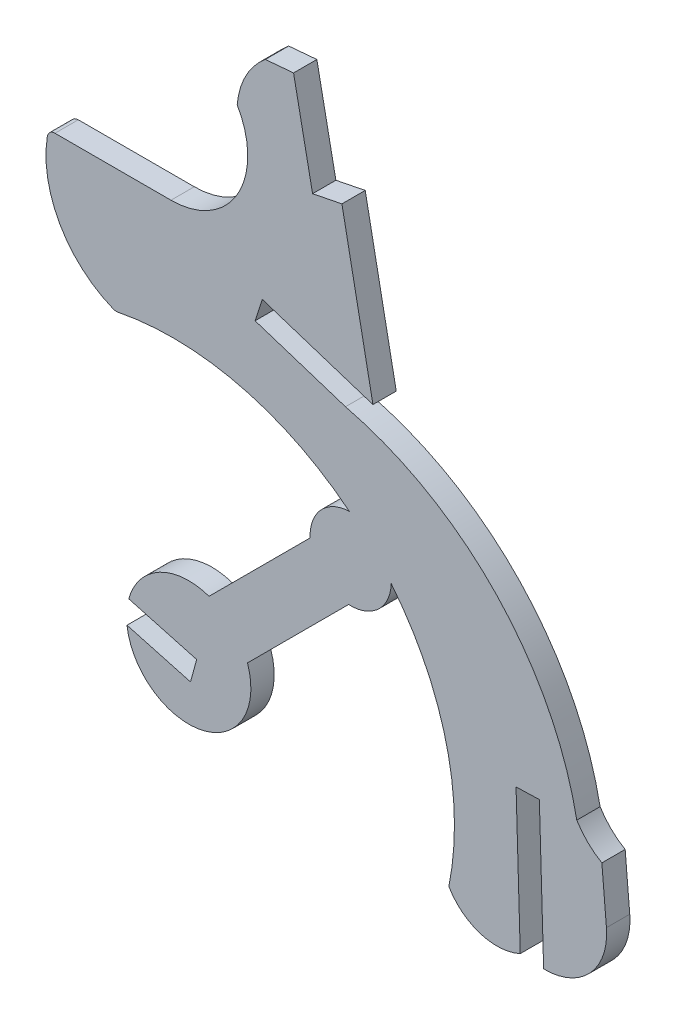
ISO-10303-21;
HEADER;
FILE_DESCRIPTION(('STEP AP214'),'2;1');
FILE_NAME('part.step','',(''),(''),'','','');
FILE_SCHEMA(('AUTOMOTIVE_DESIGN { 1 0 10303 214 1 1 1 1 }'));
ENDSEC;
DATA;
#1=APPLICATION_CONTEXT('core data for automotive mechanical design processes');
#2=APPLICATION_PROTOCOL_DEFINITION('international standard','automotive_design',2000,#1);
#3=PRODUCT_CONTEXT('',#1,'mechanical');
#4=PRODUCT('Part','Part','',(#3));
#5=PRODUCT_RELATED_PRODUCT_CATEGORY('part','',(#4));
#6=PRODUCT_DEFINITION_FORMATION('','',#4);
#7=PRODUCT_DEFINITION_CONTEXT('part definition',#1,'design');
#8=PRODUCT_DEFINITION('design','',#6,#7);
#9=PRODUCT_DEFINITION_SHAPE('','',#8);
#10=(LENGTH_UNIT() NAMED_UNIT(*) SI_UNIT(.MILLI.,.METRE.));
#11=(NAMED_UNIT(*) PLANE_ANGLE_UNIT() SI_UNIT($,.RADIAN.));
#12=(NAMED_UNIT(*) SI_UNIT($,.STERADIAN.) SOLID_ANGLE_UNIT());
#13=UNCERTAINTY_MEASURE_WITH_UNIT(LENGTH_MEASURE(1.E-05),#10,'distance_accuracy_value','');
#14=(GEOMETRIC_REPRESENTATION_CONTEXT(3) GLOBAL_UNCERTAINTY_ASSIGNED_CONTEXT((#13)) GLOBAL_UNIT_ASSIGNED_CONTEXT((#10,
#11,#12)) REPRESENTATION_CONTEXT('',''));
#15=CARTESIAN_POINT('',(0.,0.,0.));
#16=DIRECTION('',(0.,0.,1.));
#17=DIRECTION('',(1.,0.,0.));
#18=AXIS2_PLACEMENT_3D('',#15,#16,#17);
#19=CARTESIAN_POINT('',(293.065685578084,731.343473214868,3.));
#20=DIRECTION('',(-0.951371586233603,0.308045621470843,0.));
#21=DIRECTION('',(-0.308045621470843,-0.951371586233603,0.));
#22=AXIS2_PLACEMENT_3D('',#19,#20,#21);
#23=PLANE('',#22);
#24=DIRECTION('',(0.308045621470843,0.951371586233603,0.));
#25=VECTOR('',#24,1.);
#26=CARTESIAN_POINT('',(293.065685578084,731.343473214868,0.));
#27=LINE('',#26,#25);
#28=CARTESIAN_POINT('',(293.065685578084,731.343473214868,0.));
#29=VERTEX_POINT('',#28);
#30=CARTESIAN_POINT('',(293.989820861759,734.197583091601,0.));
#31=VERTEX_POINT('',#30);
#32=EDGE_CURVE('E274',#29,#31,#27,.T.);
#33=ORIENTED_EDGE('',*,*,#32,.T.);
#34=DIRECTION('',(0.,0.,-1.));
#35=VECTOR('',#34,1.);
#36=CARTESIAN_POINT('',(293.989820861759,734.197583091601,3.));
#37=LINE('',#36,#35);
#38=CARTESIAN_POINT('',(293.989820861759,734.197583091601,3.));
#39=VERTEX_POINT('',#38);
#40=EDGE_CURVE('E11',#39,#31,#37,.T.);
#41=ORIENTED_EDGE('',*,*,#40,.F.);
#42=DIRECTION('',(0.308045621470843,0.951371586233603,0.));
#43=VECTOR('',#42,1.);
#44=CARTESIAN_POINT('',(293.065685578084,731.343473214868,3.));
#45=LINE('',#44,#43);
#46=CARTESIAN_POINT('',(293.065685578084,731.343473214868,3.));
#47=VERTEX_POINT('',#46);
#48=EDGE_CURVE('E336',#47,#39,#45,.T.);
#49=ORIENTED_EDGE('',*,*,#48,.F.);
#50=DIRECTION('',(0.,0.,-1.));
#51=VECTOR('',#50,1.);
#52=CARTESIAN_POINT('',(293.065685578084,731.343473214868,3.));
#53=LINE('',#52,#51);
#54=EDGE_CURVE('E270',#47,#29,#53,.T.);
#55=ORIENTED_EDGE('',*,*,#54,.T.);
#56=EDGE_LOOP('',(#33,#41,#49,#55));
#57=FACE_BOUND('',#56,.T.);
#58=ADVANCED_FACE('F34',(#57),#23,.F.);
#59=CARTESIAN_POINT('',(293.989820861759,734.197583091601,3.));
#60=DIRECTION('',(0.308045621470846,0.951371586233602,0.));
#61=DIRECTION('',(-0.951371586233602,0.308045621470846,0.));
#62=AXIS2_PLACEMENT_3D('',#59,#60,#61);
#63=PLANE('',#62);
#64=DIRECTION('',(0.951371586233602,-0.308045621470846,0.));
#65=VECTOR('',#64,1.);
#66=CARTESIAN_POINT('',(293.989820861759,734.197583091601,0.));
#67=LINE('',#66,#65);
#68=CARTESIAN_POINT('',(308.230093843599,729.586709901693,0.));
#69=VERTEX_POINT('',#68);
#70=EDGE_CURVE('E277',#31,#69,#67,.T.);
#71=ORIENTED_EDGE('',*,*,#70,.T.);
#72=DIRECTION('',(0.,0.,-1.));
#73=VECTOR('',#72,1.);
#74=CARTESIAN_POINT('',(308.230093843599,729.586709901693,3.));
#75=LINE('',#74,#73);
#76=CARTESIAN_POINT('',(308.230093843599,729.586709901693,3.));
#77=VERTEX_POINT('',#76);
#78=EDGE_CURVE('E42',#77,#69,#75,.T.);
#79=ORIENTED_EDGE('',*,*,#78,.F.);
#80=DIRECTION('',(0.951371586233602,-0.308045621470846,0.));
#81=VECTOR('',#80,1.);
#82=CARTESIAN_POINT('',(293.989820861759,734.197583091601,3.));
#83=LINE('',#82,#81);
#84=EDGE_CURVE('E165',#39,#77,#83,.T.);
#85=ORIENTED_EDGE('',*,*,#84,.F.);
#86=ORIENTED_EDGE('',*,*,#40,.T.);
#87=EDGE_LOOP('',(#71,#79,#85,#86));
#88=FACE_BOUND('',#87,.T.);
#89=ADVANCED_FACE('F514',(#88),#63,.F.);
#90=CARTESIAN_POINT('',(304.237578803965,749.960041405794,3.));
#91=DIRECTION('',(-0.981334260891435,-0.192309823983752,0.));
#92=DIRECTION('',(0.192309823983752,-0.981334260891435,0.));
#93=AXIS2_PLACEMENT_3D('',#90,#91,#92);
#94=PLANE('',#93);
#95=DIRECTION('',(-0.192309823983752,0.981334260891435,0.));
#96=VECTOR('',#95,1.);
#97=CARTESIAN_POINT('',(304.237578803965,749.960041405794,0.));
#98=LINE('',#97,#96);
#99=CARTESIAN_POINT('',(304.237578803965,749.960041405794,0.));
#100=VERTEX_POINT('',#99);
#101=EDGE_CURVE('E279',#69,#100,#98,.T.);
#102=ORIENTED_EDGE('',*,*,#101,.T.);
#103=DIRECTION('',(0.,0.,-1.));
#104=VECTOR('',#103,1.);
#105=CARTESIAN_POINT('',(304.237578803965,749.960041405794,3.));
#106=LINE('',#105,#104);
#107=CARTESIAN_POINT('',(304.237578803965,749.960041405794,3.));
#108=VERTEX_POINT('',#107);
#109=EDGE_CURVE('E415',#108,#100,#106,.T.);
#110=ORIENTED_EDGE('',*,*,#109,.F.);
#111=DIRECTION('',(-0.192309823983752,0.981334260891435,0.));
#112=VECTOR('',#111,1.);
#113=CARTESIAN_POINT('',(304.237578803965,749.960041405794,3.));
#114=LINE('',#113,#112);
#115=EDGE_CURVE('E423',#77,#108,#114,.T.);
#116=ORIENTED_EDGE('',*,*,#115,.F.);
#117=ORIENTED_EDGE('',*,*,#78,.T.);
#118=EDGE_LOOP('',(#102,#110,#116,#117));
#119=FACE_BOUND('',#118,.T.);
#120=ADVANCED_FACE('F421',(#119),#94,.F.);
#121=CARTESIAN_POINT('',(304.237578803965,749.960041405794,3.));
#122=DIRECTION('',(0.196059702771073,-0.980591960475568,0.));
#123=DIRECTION('',(0.980591960475568,0.196059702771073,0.));
#124=AXIS2_PLACEMENT_3D('',#121,#122,#123);
#125=PLANE('',#124);
#126=DIRECTION('',(-0.980591960475568,-0.196059702771073,0.));
#127=VECTOR('',#126,1.);
#128=CARTESIAN_POINT('',(304.237578803965,749.960041405794,0.));
#129=LINE('',#128,#127);
#130=CARTESIAN_POINT('',(300.461876989639,749.205127022129,0.));
#131=VERTEX_POINT('',#130);
#132=EDGE_CURVE('E281',#100,#131,#129,.T.);
#133=ORIENTED_EDGE('',*,*,#132,.T.);
#134=DIRECTION('',(0.,0.,-1.));
#135=VECTOR('',#134,1.);
#136=CARTESIAN_POINT('',(300.461876989639,749.205127022129,3.));
#137=LINE('',#136,#135);
#138=CARTESIAN_POINT('',(300.461876989639,749.205127022129,3.));
#139=VERTEX_POINT('',#138);
#140=EDGE_CURVE('E412',#139,#131,#137,.T.);
#141=ORIENTED_EDGE('',*,*,#140,.F.);
#142=DIRECTION('',(-0.980591960475568,-0.196059702771073,0.));
#143=VECTOR('',#142,1.);
#144=CARTESIAN_POINT('',(304.237578803965,749.960041405794,3.));
#145=LINE('',#144,#143);
#146=EDGE_CURVE('E441',#108,#139,#145,.T.);
#147=ORIENTED_EDGE('',*,*,#146,.F.);
#148=ORIENTED_EDGE('',*,*,#109,.T.);
#149=EDGE_LOOP('',(#133,#141,#147,#148));
#150=FACE_BOUND('',#149,.T.);
#151=ADVANCED_FACE('F432',(#150),#125,.F.);
#152=CARTESIAN_POINT('',(300.461876989639,749.205127022129,3.));
#153=DIRECTION('',(-0.98059196047557,-0.196059702771065,0.));
#154=DIRECTION('',(0.196059702771066,-0.98059196047557,0.));
#155=AXIS2_PLACEMENT_3D('',#152,#153,#154);
#156=PLANE('',#155);
#157=DIRECTION('',(-0.196059702771066,0.98059196047557,0.));
#158=VECTOR('',#157,1.);
#159=CARTESIAN_POINT('',(300.461876989639,749.205127022129,0.));
#160=LINE('',#159,#158);
#161=CARTESIAN_POINT('',(298.014696402682,761.444692702814,0.));
#162=VERTEX_POINT('',#161);
#163=EDGE_CURVE('E283',#131,#162,#160,.T.);
#164=ORIENTED_EDGE('',*,*,#163,.T.);
#165=DIRECTION('',(0.,0.,-1.));
#166=VECTOR('',#165,1.);
#167=CARTESIAN_POINT('',(298.014696402682,761.444692702814,3.));
#168=LINE('',#167,#166);
#169=CARTESIAN_POINT('',(298.014696402682,761.444692702814,3.));
#170=VERTEX_POINT('',#169);
#171=EDGE_CURVE('E409',#170,#162,#168,.T.);
#172=ORIENTED_EDGE('',*,*,#171,.F.);
#173=DIRECTION('',(-0.196059702771066,0.98059196047557,0.));
#174=VECTOR('',#173,1.);
#175=CARTESIAN_POINT('',(300.461876989639,749.205127022129,3.));
#176=LINE('',#175,#174);
#177=EDGE_CURVE('E438',#139,#170,#176,.T.);
#178=ORIENTED_EDGE('',*,*,#177,.F.);
#179=ORIENTED_EDGE('',*,*,#140,.T.);
#180=EDGE_LOOP('',(#164,#172,#178,#179));
#181=FACE_BOUND('',#180,.T.);
#182=ADVANCED_FACE('F436',(#181),#156,.F.);
#183=CARTESIAN_POINT('',(298.014696402682,761.444692702814,3.));
#184=DIRECTION('',(0.0872020705690087,-0.996190643847089,0.));
#185=DIRECTION('',(0.996190643847089,0.0872020705690087,0.));
#186=AXIS2_PLACEMENT_3D('',#183,#184,#185);
#187=PLANE('',#186);
#188=DIRECTION('',(-0.996190643847089,-0.0872020705690087,0.));
#189=VECTOR('',#188,1.);
#190=CARTESIAN_POINT('',(298.014696402682,761.444692702814,0.));
#191=LINE('',#190,#189);
#192=CARTESIAN_POINT('',(294.380010044937,761.126528525885,0.));
#193=VERTEX_POINT('',#192);
#194=EDGE_CURVE('E285',#162,#193,#191,.T.);
#195=ORIENTED_EDGE('',*,*,#194,.T.);
#196=DIRECTION('',(0.,0.,-1.));
#197=VECTOR('',#196,1.);
#198=CARTESIAN_POINT('',(294.380010044937,761.126528525885,3.));
#199=LINE('',#198,#197);
#200=CARTESIAN_POINT('',(294.380010044937,761.126528525885,3.));
#201=VERTEX_POINT('',#200);
#202=EDGE_CURVE('E406',#201,#193,#199,.T.);
#203=ORIENTED_EDGE('',*,*,#202,.F.);
#204=DIRECTION('',(-0.996190643847089,-0.0872020705690087,0.));
#205=VECTOR('',#204,1.);
#206=CARTESIAN_POINT('',(298.014696402682,761.444692702814,3.));
#207=LINE('',#206,#205);
#208=EDGE_CURVE('E440',#170,#201,#207,.T.);
#209=ORIENTED_EDGE('',*,*,#208,.F.);
#210=ORIENTED_EDGE('',*,*,#171,.T.);
#211=EDGE_LOOP('',(#195,#203,#209,#210));
#212=FACE_BOUND('',#211,.T.);
#213=ADVANCED_FACE('F527',(#212),#187,.F.);
#214=CARTESIAN_POINT('',(300.689284113547,753.41474699255,3.));
#215=DIRECTION('',(0.,0.,-1.));
#216=DIRECTION('',(-1.,0.,0.));
#217=AXIS2_PLACEMENT_3D('',#214,#215,#216);
#218=CYLINDRICAL_SURFACE('',#217,9.96386038093235);
#219=CARTESIAN_POINT('',(300.689284113547,753.41474699255,0.));
#220=DIRECTION('',(0.,0.,1.));
#221=DIRECTION('',(1.,0.,0.));
#222=AXIS2_PLACEMENT_3D('',#219,#220,#221);
#223=CIRCLE('',#222,9.96386038093235);
#224=CARTESIAN_POINT('',(290.760865869976,754.254404584339,0.));
#225=VERTEX_POINT('',#224);
#226=EDGE_CURVE('E287',#193,#225,#223,.T.);
#227=ORIENTED_EDGE('',*,*,#226,.T.);
#228=DIRECTION('',(0.,0.,-1.));
#229=VECTOR('',#228,1.);
#230=CARTESIAN_POINT('',(290.760865869976,754.254404584339,3.));
#231=LINE('',#230,#229);
#232=CARTESIAN_POINT('',(290.760865869976,754.254404584339,3.));
#233=VERTEX_POINT('',#232);
#234=EDGE_CURVE('E403',#233,#225,#231,.T.);
#235=ORIENTED_EDGE('',*,*,#234,.F.);
#236=CARTESIAN_POINT('',(300.689284113547,753.41474699255,3.));
#237=DIRECTION('',(0.,0.,1.));
#238=DIRECTION('',(1.,0.,0.));
#239=AXIS2_PLACEMENT_3D('',#236,#237,#238);
#240=CIRCLE('',#239,9.96386038093235);
#241=EDGE_CURVE('E443',#201,#233,#240,.T.);
#242=ORIENTED_EDGE('',*,*,#241,.F.);
#243=ORIENTED_EDGE('',*,*,#202,.T.);
#244=EDGE_LOOP('',(#227,#235,#242,#243));
#245=FACE_BOUND('',#244,.T.);
#246=ADVANCED_FACE('F530',(#245),#218,.T.);
#247=CARTESIAN_POINT('',(282.238682163029,749.250936619308,3.));
#248=DIRECTION('',(0.,0.,-1.));
#249=DIRECTION('',(-1.,0.,0.));
#250=AXIS2_PLACEMENT_3D('',#247,#248,#249);
#251=CYLINDRICAL_SURFACE('',#250,9.88242413641695);
#252=CARTESIAN_POINT('',(282.238682163029,749.250936619308,0.));
#253=DIRECTION('',(0.,0.,-1.));
#254=DIRECTION('',(1.,0.,0.));
#255=AXIS2_PLACEMENT_3D('',#252,#253,#254);
#256=CIRCLE('',#255,9.88242413641695);
#257=CARTESIAN_POINT('',(282.238682163029,739.368512482891,0.));
#258=VERTEX_POINT('',#257);
#259=EDGE_CURVE('E289',#225,#258,#256,.T.);
#260=ORIENTED_EDGE('',*,*,#259,.T.);
#261=DIRECTION('',(0.,0.,-1.));
#262=VECTOR('',#261,1.);
#263=CARTESIAN_POINT('',(282.238682163029,739.368512482891,3.));
#264=LINE('',#263,#262);
#265=CARTESIAN_POINT('',(282.238682163029,739.368512482891,3.));
#266=VERTEX_POINT('',#265);
#267=EDGE_CURVE('E400',#266,#258,#264,.T.);
#268=ORIENTED_EDGE('',*,*,#267,.F.);
#269=CARTESIAN_POINT('',(282.238682163029,749.250936619308,3.));
#270=DIRECTION('',(0.,0.,-1.));
#271=DIRECTION('',(1.,0.,0.));
#272=AXIS2_PLACEMENT_3D('',#269,#270,#271);
#273=CIRCLE('',#272,9.88242413641695);
#274=EDGE_CURVE('E449',#233,#266,#273,.T.);
#275=ORIENTED_EDGE('',*,*,#274,.F.);
#276=ORIENTED_EDGE('',*,*,#234,.T.);
#277=EDGE_LOOP('',(#260,#268,#275,#276));
#278=FACE_BOUND('',#277,.T.);
#279=ADVANCED_FACE('F534',(#278),#251,.F.);
#280=CARTESIAN_POINT('',(282.238682163029,739.368512482891,3.));
#281=DIRECTION('',(0.,-1.,0.));
#282=DIRECTION('',(1.,0.,0.));
#283=AXIS2_PLACEMENT_3D('',#280,#281,#282);
#284=PLANE('',#283);
#285=DIRECTION('',(-1.,0.,0.));
#286=VECTOR('',#285,1.);
#287=CARTESIAN_POINT('',(282.238682163029,739.368512482891,0.));
#288=LINE('',#287,#286);
#289=CARTESIAN_POINT('',(267.309755895386,739.368512482891,0.));
#290=VERTEX_POINT('',#289);
#291=EDGE_CURVE('E291',#258,#290,#288,.T.);
#292=ORIENTED_EDGE('',*,*,#291,.T.);
#293=DIRECTION('',(0.,0.,-1.));
#294=VECTOR('',#293,1.);
#295=CARTESIAN_POINT('',(267.309755895386,739.368512482891,3.));
#296=LINE('',#295,#294);
#297=CARTESIAN_POINT('',(267.309755895386,739.368512482891,3.));
#298=VERTEX_POINT('',#297);
#299=EDGE_CURVE('E397',#298,#290,#296,.T.);
#300=ORIENTED_EDGE('',*,*,#299,.F.);
#301=DIRECTION('',(-1.,0.,0.));
#302=VECTOR('',#301,1.);
#303=CARTESIAN_POINT('',(282.238682163029,739.368512482891,3.));
#304=LINE('',#303,#302);
#305=EDGE_CURVE('E451',#266,#298,#304,.T.);
#306=ORIENTED_EDGE('',*,*,#305,.F.);
#307=ORIENTED_EDGE('',*,*,#267,.T.);
#308=EDGE_LOOP('',(#292,#300,#306,#307));
#309=FACE_BOUND('',#308,.T.);
#310=ADVANCED_FACE('F538',(#309),#284,.F.);
#311=CARTESIAN_POINT('',(267.309755895386,738.368512482891,3.));
#312=DIRECTION('',(0.,0.,-1.));
#313=DIRECTION('',(-1.,0.,0.));
#314=AXIS2_PLACEMENT_3D('',#311,#312,#313);
#315=CYLINDRICAL_SURFACE('',#314,1.);
#316=CARTESIAN_POINT('',(267.309755895386,738.368512482891,0.));
#317=DIRECTION('',(0.,0.,1.));
#318=DIRECTION('',(-1.,0.,0.));
#319=AXIS2_PLACEMENT_3D('',#316,#317,#318);
#320=CIRCLE('',#319,1.);
#321=CARTESIAN_POINT('',(266.322292677375,738.52636175617,0.));
#322=VERTEX_POINT('',#321);
#323=EDGE_CURVE('E293',#290,#322,#320,.T.);
#324=ORIENTED_EDGE('',*,*,#323,.T.);
#325=DIRECTION('',(0.,0.,-1.));
#326=VECTOR('',#325,1.);
#327=CARTESIAN_POINT('',(266.322292677375,738.52636175617,3.));
#328=LINE('',#327,#326);
#329=CARTESIAN_POINT('',(266.322292677375,738.52636175617,3.));
#330=VERTEX_POINT('',#329);
#331=EDGE_CURVE('E394',#330,#322,#328,.T.);
#332=ORIENTED_EDGE('',*,*,#331,.F.);
#333=CARTESIAN_POINT('',(267.309755895386,738.368512482891,3.));
#334=DIRECTION('',(0.,0.,1.));
#335=DIRECTION('',(-1.,0.,0.));
#336=AXIS2_PLACEMENT_3D('',#333,#334,#335);
#337=CIRCLE('',#336,1.);
#338=EDGE_CURVE('E453',#298,#330,#337,.T.);
#339=ORIENTED_EDGE('',*,*,#338,.F.);
#340=ORIENTED_EDGE('',*,*,#299,.T.);
#341=EDGE_LOOP('',(#324,#332,#339,#340));
#342=FACE_BOUND('',#341,.T.);
#343=ADVANCED_FACE('F542',(#342),#315,.T.);
#344=CARTESIAN_POINT('',(279.958666677143,736.34654210642,3.));
#345=DIRECTION('',(0.,0.,-1.));
#346=DIRECTION('',(-1.,0.,0.));
#347=AXIS2_PLACEMENT_3D('',#344,#345,#346);
#348=CYLINDRICAL_SURFACE('',#347,13.8095006994094);
#349=CARTESIAN_POINT('',(279.958666677143,736.34654210642,0.));
#350=DIRECTION('',(0.,0.,1.));
#351=DIRECTION('',(1.,0.,0.));
#352=AXIS2_PLACEMENT_3D('',#349,#350,#351);
#353=CIRCLE('',#352,13.8095006994094);
#354=CARTESIAN_POINT('',(274.828113717112,723.525476008341,0.));
#355=VERTEX_POINT('',#354);
#356=EDGE_CURVE('E295',#322,#355,#353,.T.);
#357=ORIENTED_EDGE('',*,*,#356,.T.);
#358=DIRECTION('',(0.,0.,-1.));
#359=VECTOR('',#358,1.);
#360=CARTESIAN_POINT('',(274.828113717112,723.525476008341,3.));
#361=LINE('',#360,#359);
#362=CARTESIAN_POINT('',(274.828113717112,723.525476008341,3.));
#363=VERTEX_POINT('',#362);
#364=EDGE_CURVE('E391',#363,#355,#361,.T.);
#365=ORIENTED_EDGE('',*,*,#364,.F.);
#366=CARTESIAN_POINT('',(279.958666677143,736.34654210642,3.));
#367=DIRECTION('',(0.,0.,1.));
#368=DIRECTION('',(1.,0.,0.));
#369=AXIS2_PLACEMENT_3D('',#366,#367,#368);
#370=CIRCLE('',#369,13.8095006994094);
#371=EDGE_CURVE('E455',#330,#363,#370,.T.);
#372=ORIENTED_EDGE('',*,*,#371,.F.);
#373=ORIENTED_EDGE('',*,*,#331,.T.);
#374=EDGE_LOOP('',(#357,#365,#372,#373));
#375=FACE_BOUND('',#374,.T.);
#376=ADVANCED_FACE('F546',(#375),#348,.T.);
#377=CARTESIAN_POINT('',(275.199637139407,724.453899589842,3.));
#378=DIRECTION('',(0.,0.,-1.));
#379=DIRECTION('',(-1.,0.,0.));
#380=AXIS2_PLACEMENT_3D('',#377,#378,#379);
#381=CYLINDRICAL_SURFACE('',#380,0.999999999999984);
#382=CARTESIAN_POINT('',(275.199637139407,724.453899589842,0.));
#383=DIRECTION('',(0.,0.,1.));
#384=DIRECTION('',(-1.,0.,0.));
#385=AXIS2_PLACEMENT_3D('',#382,#383,#384);
#386=CIRCLE('',#385,0.999999999999984);
#387=CARTESIAN_POINT('',(275.394960470733,723.473160686647,0.));
#388=VERTEX_POINT('',#387);
#389=EDGE_CURVE('E297',#355,#388,#386,.T.);
#390=ORIENTED_EDGE('',*,*,#389,.T.);
#391=DIRECTION('',(0.,0.,-1.));
#392=VECTOR('',#391,1.);
#393=CARTESIAN_POINT('',(275.394960470733,723.473160686647,3.));
#394=LINE('',#393,#392);
#395=CARTESIAN_POINT('',(275.394960470733,723.473160686647,3.));
#396=VERTEX_POINT('',#395);
#397=EDGE_CURVE('E388',#396,#388,#394,.T.);
#398=ORIENTED_EDGE('',*,*,#397,.F.);
#399=CARTESIAN_POINT('',(275.199637139407,724.453899589842,3.));
#400=DIRECTION('',(0.,0.,1.));
#401=DIRECTION('',(-1.,0.,0.));
#402=AXIS2_PLACEMENT_3D('',#399,#400,#401);
#403=CIRCLE('',#402,0.999999999999984);
#404=EDGE_CURVE('E457',#363,#396,#403,.T.);
#405=ORIENTED_EDGE('',*,*,#404,.F.);
#406=ORIENTED_EDGE('',*,*,#364,.T.);
#407=EDGE_LOOP('',(#390,#398,#405,#406));
#408=FACE_BOUND('',#407,.T.);
#409=ADVANCED_FACE('F550',(#408),#381,.T.);
#410=CARTESIAN_POINT('',(282.474589139172,687.925603678616,3.));
#411=DIRECTION('',(0.,0.,-1.));
#412=DIRECTION('',(-1.,0.,0.));
#413=AXIS2_PLACEMENT_3D('',#410,#411,#412);
#414=CYLINDRICAL_SURFACE('',#413,36.2456887273815);
#415=CARTESIAN_POINT('',(282.474589139172,687.925603678616,0.));
#416=DIRECTION('',(0.,0.,-1.));
#417=DIRECTION('',(1.,0.,0.));
#418=AXIS2_PLACEMENT_3D('',#415,#416,#417);
#419=CIRCLE('',#418,36.2456887273815);
#420=CARTESIAN_POINT('',(305.196249522095,716.165223023879,0.));
#421=VERTEX_POINT('',#420);
#422=EDGE_CURVE('E299',#388,#421,#419,.T.);
#423=ORIENTED_EDGE('',*,*,#422,.T.);
#424=DIRECTION('',(0.,0.,-1.));
#425=VECTOR('',#424,1.);
#426=CARTESIAN_POINT('',(305.196249522095,716.165223023879,3.));
#427=LINE('',#426,#425);
#428=CARTESIAN_POINT('',(305.196249522095,716.165223023879,3.));
#429=VERTEX_POINT('',#428);
#430=EDGE_CURVE('E385',#429,#421,#427,.T.);
#431=ORIENTED_EDGE('',*,*,#430,.F.);
#432=CARTESIAN_POINT('',(282.474589139172,687.925603678616,3.));
#433=DIRECTION('',(0.,0.,-1.));
#434=DIRECTION('',(1.,0.,0.));
#435=AXIS2_PLACEMENT_3D('',#432,#433,#434);
#436=CIRCLE('',#435,36.2456887273815);
#437=EDGE_CURVE('E459',#396,#429,#436,.T.);
#438=ORIENTED_EDGE('',*,*,#437,.F.);
#439=ORIENTED_EDGE('',*,*,#397,.T.);
#440=EDGE_LOOP('',(#423,#431,#438,#439));
#441=FACE_BOUND('',#440,.T.);
#442=ADVANCED_FACE('F554',(#441),#414,.F.);
#443=CARTESIAN_POINT('',(305.362815937333,710.950979858334,3.));
#444=DIRECTION('',(0.,0.,-1.));
#445=DIRECTION('',(-1.,0.,0.));
#446=AXIS2_PLACEMENT_3D('',#443,#444,#445);
#447=CYLINDRICAL_SURFACE('',#446,5.21690292799397);
#448=CARTESIAN_POINT('',(305.362815937333,710.950979858334,0.));
#449=DIRECTION('',(0.,0.,1.));
#450=DIRECTION('',(1.,0.,0.));
#451=AXIS2_PLACEMENT_3D('',#448,#449,#450);
#452=CIRCLE('',#451,5.21690292799397);
#453=CARTESIAN_POINT('',(300.152427977289,710.690339366595,0.));
#454=VERTEX_POINT('',#453);
#455=EDGE_CURVE('E301',#421,#454,#452,.T.);
#456=ORIENTED_EDGE('',*,*,#455,.T.);
#457=DIRECTION('',(0.,0.,-1.));
#458=VECTOR('',#457,1.);
#459=CARTESIAN_POINT('',(300.152427977289,710.690339366595,3.));
#460=LINE('',#459,#458);
#461=CARTESIAN_POINT('',(300.152427977289,710.690339366595,3.));
#462=VERTEX_POINT('',#461);
#463=EDGE_CURVE('E382',#462,#454,#460,.T.);
#464=ORIENTED_EDGE('',*,*,#463,.F.);
#465=CARTESIAN_POINT('',(305.362815937333,710.950979858334,3.));
#466=DIRECTION('',(0.,0.,1.));
#467=DIRECTION('',(1.,0.,0.));
#468=AXIS2_PLACEMENT_3D('',#465,#466,#467);
#469=CIRCLE('',#468,5.21690292799397);
#470=EDGE_CURVE('E461',#429,#462,#469,.T.);
#471=ORIENTED_EDGE('',*,*,#470,.F.);
#472=ORIENTED_EDGE('',*,*,#430,.T.);
#473=EDGE_LOOP('',(#456,#464,#471,#472));
#474=FACE_BOUND('',#473,.T.);
#475=ADVANCED_FACE('F558',(#474),#447,.T.);
#476=CARTESIAN_POINT('',(300.152427977289,710.690339366595,3.));
#477=DIRECTION('',(0.707106781186544,-0.70710678118655,0.));
#478=DIRECTION('',(0.707106781186551,0.707106781186545,0.));
#479=AXIS2_PLACEMENT_3D('',#476,#477,#478);
#480=PLANE('',#479);
#481=DIRECTION('',(-0.707106781186551,-0.707106781186545,0.));
#482=VECTOR('',#481,1.);
#483=CARTESIAN_POINT('',(300.152427977289,710.690339366595,0.));
#484=LINE('',#483,#482);
#485=CARTESIAN_POINT('',(287.135003329302,697.672914718609,0.));
#486=VERTEX_POINT('',#485);
#487=EDGE_CURVE('E303',#454,#486,#484,.T.);
#488=ORIENTED_EDGE('',*,*,#487,.T.);
#489=DIRECTION('',(0.,0.,-1.));
#490=VECTOR('',#489,1.);
#491=CARTESIAN_POINT('',(287.135003329302,697.672914718609,3.));
#492=LINE('',#491,#490);
#493=CARTESIAN_POINT('',(287.135003329302,697.672914718609,3.));
#494=VERTEX_POINT('',#493);
#495=EDGE_CURVE('E379',#494,#486,#492,.T.);
#496=ORIENTED_EDGE('',*,*,#495,.F.);
#497=DIRECTION('',(-0.707106781186551,-0.707106781186545,0.));
#498=VECTOR('',#497,1.);
#499=CARTESIAN_POINT('',(300.152427977289,710.690339366595,3.));
#500=LINE('',#499,#498);
#501=EDGE_CURVE('E463',#462,#494,#500,.T.);
#502=ORIENTED_EDGE('',*,*,#501,.F.);
#503=ORIENTED_EDGE('',*,*,#463,.T.);
#504=EDGE_LOOP('',(#488,#496,#502,#503));
#505=FACE_BOUND('',#504,.T.);
#506=ADVANCED_FACE('F562',(#505),#480,.F.);
#507=CARTESIAN_POINT('',(284.523129576111,690.111293497112,3.));
#508=DIRECTION('',(0.,0.,-1.));
#509=DIRECTION('',(-1.,0.,0.));
#510=AXIS2_PLACEMENT_3D('',#507,#508,#509);
#511=CYLINDRICAL_SURFACE('',#510,8.00000000000004);
#512=CARTESIAN_POINT('',(284.523129576111,690.111293497112,0.));
#513=DIRECTION('',(0.,0.,1.));
#514=DIRECTION('',(1.,0.,0.));
#515=AXIS2_PLACEMENT_3D('',#512,#513,#514);
#516=CIRCLE('',#515,8.00000000000004);
#517=CARTESIAN_POINT('',(276.806041279698,692.219977500314,0.));
#518=VERTEX_POINT('',#517);
#519=EDGE_CURVE('E305',#486,#518,#516,.T.);
#520=ORIENTED_EDGE('',*,*,#519,.T.);
#521=DIRECTION('',(0.,0.,-1.));
#522=VECTOR('',#521,1.);
#523=CARTESIAN_POINT('',(276.806041279698,692.219977500314,3.));
#524=LINE('',#523,#522);
#525=CARTESIAN_POINT('',(276.806041279698,692.219977500314,3.));
#526=VERTEX_POINT('',#525);
#527=EDGE_CURVE('E376',#526,#518,#524,.T.);
#528=ORIENTED_EDGE('',*,*,#527,.F.);
#529=CARTESIAN_POINT('',(284.523129576111,690.111293497112,3.));
#530=DIRECTION('',(0.,0.,1.));
#531=DIRECTION('',(1.,0.,0.));
#532=AXIS2_PLACEMENT_3D('',#529,#530,#531);
#533=CIRCLE('',#532,8.00000000000004);
#534=EDGE_CURVE('E465',#494,#526,#533,.T.);
#535=ORIENTED_EDGE('',*,*,#534,.F.);
#536=ORIENTED_EDGE('',*,*,#495,.T.);
#537=EDGE_LOOP('',(#520,#528,#535,#536));
#538=FACE_BOUND('',#537,.T.);
#539=ADVANCED_FACE('F566',(#538),#511,.T.);
#540=CARTESIAN_POINT('',(276.806041279698,692.219977500314,3.));
#541=DIRECTION('',(0.263585500400224,0.964636037051677,0.));
#542=DIRECTION('',(-0.964636037051677,0.263585500400224,0.));
#543=AXIS2_PLACEMENT_3D('',#540,#541,#542);
#544=PLANE('',#543);
#545=DIRECTION('',(0.964636037051677,-0.263585500400224,0.));
#546=VECTOR('',#545,1.);
#547=CARTESIAN_POINT('',(276.806041279698,692.219977500314,0.));
#548=LINE('',#547,#546);
#549=CARTESIAN_POINT('',(285.544339655222,689.83224921577,0.));
#550=VERTEX_POINT('',#549);
#551=EDGE_CURVE('E307',#518,#550,#548,.T.);
#552=ORIENTED_EDGE('',*,*,#551,.T.);
#553=DIRECTION('',(0.,0.,-1.));
#554=VECTOR('',#553,1.);
#555=CARTESIAN_POINT('',(285.544339655222,689.83224921577,3.));
#556=LINE('',#555,#554);
#557=CARTESIAN_POINT('',(285.544339655222,689.83224921577,3.));
#558=VERTEX_POINT('',#557);
#559=EDGE_CURVE('E373',#558,#550,#556,.T.);
#560=ORIENTED_EDGE('',*,*,#559,.F.);
#561=DIRECTION('',(0.964636037051677,-0.263585500400224,0.));
#562=VECTOR('',#561,1.);
#563=CARTESIAN_POINT('',(276.806041279698,692.219977500314,3.));
#564=LINE('',#563,#562);
#565=EDGE_CURVE('E467',#526,#558,#564,.T.);
#566=ORIENTED_EDGE('',*,*,#565,.F.);
#567=ORIENTED_EDGE('',*,*,#527,.T.);
#568=EDGE_LOOP('',(#552,#560,#566,#567));
#569=FACE_BOUND('',#568,.T.);
#570=ADVANCED_FACE('F570',(#569),#544,.F.);
#571=CARTESIAN_POINT('',(284.753581200171,686.938339056612,3.));
#572=DIRECTION('',(0.964635918883623,-0.263585932855964,0.));
#573=DIRECTION('',(0.263585932855964,0.964635918883623,0.));
#574=AXIS2_PLACEMENT_3D('',#571,#572,#573);
#575=PLANE('',#574);
#576=DIRECTION('',(-0.263585932855964,-0.964635918883623,0.));
#577=VECTOR('',#576,1.);
#578=CARTESIAN_POINT('',(284.753581200171,686.938339056612,0.));
#579=LINE('',#578,#577);
#580=CARTESIAN_POINT('',(284.753581200171,686.938339056612,0.));
#581=VERTEX_POINT('',#580);
#582=EDGE_CURVE('E309',#550,#581,#579,.T.);
#583=ORIENTED_EDGE('',*,*,#582,.T.);
#584=DIRECTION('',(0.,0.,-1.));
#585=VECTOR('',#584,1.);
#586=CARTESIAN_POINT('',(284.753581200171,686.938339056612,3.));
#587=LINE('',#586,#585);
#588=CARTESIAN_POINT('',(284.753581200171,686.938339056612,3.));
#589=VERTEX_POINT('',#588);
#590=EDGE_CURVE('E370',#589,#581,#587,.T.);
#591=ORIENTED_EDGE('',*,*,#590,.F.);
#592=DIRECTION('',(-0.263585932855964,-0.964635918883623,0.));
#593=VECTOR('',#592,1.);
#594=CARTESIAN_POINT('',(284.753581200171,686.938339056612,3.));
#595=LINE('',#594,#593);
#596=EDGE_CURVE('E469',#558,#589,#595,.T.);
#597=ORIENTED_EDGE('',*,*,#596,.F.);
#598=ORIENTED_EDGE('',*,*,#559,.T.);
#599=EDGE_LOOP('',(#583,#591,#597,#598));
#600=FACE_BOUND('',#599,.T.);
#601=ADVANCED_FACE('F574',(#600),#575,.F.);
#602=CARTESIAN_POINT('',(276.578441434584,689.172182037337,3.));
#603=DIRECTION('',(-0.263585174224127,-0.964636126178797,0.));
#604=DIRECTION('',(0.964636126178797,-0.263585174224127,0.));
#605=AXIS2_PLACEMENT_3D('',#602,#603,#604);
#606=PLANE('',#605);
#607=DIRECTION('',(-0.964636126178797,0.263585174224127,0.));
#608=VECTOR('',#607,1.);
#609=CARTESIAN_POINT('',(276.578441434584,689.172182037337,0.));
#610=LINE('',#609,#608);
#611=CARTESIAN_POINT('',(276.578441434584,689.172182037337,0.));
#612=VERTEX_POINT('',#611);
#613=EDGE_CURVE('E311',#581,#612,#610,.T.);
#614=ORIENTED_EDGE('',*,*,#613,.T.);
#615=DIRECTION('',(0.,0.,-1.));
#616=VECTOR('',#615,1.);
#617=CARTESIAN_POINT('',(276.578441434584,689.172182037337,3.));
#618=LINE('',#617,#616);
#619=CARTESIAN_POINT('',(276.578441434584,689.172182037337,3.));
#620=VERTEX_POINT('',#619);
#621=EDGE_CURVE('E367',#620,#612,#618,.T.);
#622=ORIENTED_EDGE('',*,*,#621,.F.);
#623=DIRECTION('',(-0.964636126178797,0.263585174224127,0.));
#624=VECTOR('',#623,1.);
#625=CARTESIAN_POINT('',(276.578441434584,689.172182037337,3.));
#626=LINE('',#625,#624);
#627=EDGE_CURVE('E471',#589,#620,#626,.T.);
#628=ORIENTED_EDGE('',*,*,#627,.F.);
#629=ORIENTED_EDGE('',*,*,#590,.T.);
#630=EDGE_LOOP('',(#614,#622,#628,#629));
#631=FACE_BOUND('',#630,.T.);
#632=ADVANCED_FACE('F578',(#631),#606,.F.);
#633=CARTESIAN_POINT('',(284.523129576111,690.111293497112,3.));
#634=DIRECTION('',(0.,0.,-1.));
#635=DIRECTION('',(-1.,0.,0.));
#636=AXIS2_PLACEMENT_3D('',#633,#634,#635);
#637=CYLINDRICAL_SURFACE('',#636,7.99999999999995);
#638=CARTESIAN_POINT('',(284.523129576111,690.111293497112,0.));
#639=DIRECTION('',(0.,0.,1.));
#640=DIRECTION('',(1.,0.,0.));
#641=AXIS2_PLACEMENT_3D('',#638,#639,#640);
#642=CIRCLE('',#641,7.99999999999995);
#643=CARTESIAN_POINT('',(292.084750797608,692.723167250303,0.));
#644=VERTEX_POINT('',#643);
#645=EDGE_CURVE('E313',#612,#644,#642,.T.);
#646=ORIENTED_EDGE('',*,*,#645,.T.);
#647=DIRECTION('',(0.,0.,-1.));
#648=VECTOR('',#647,1.);
#649=CARTESIAN_POINT('',(292.084750797608,692.723167250303,3.));
#650=LINE('',#649,#648);
#651=CARTESIAN_POINT('',(292.084750797608,692.723167250303,3.));
#652=VERTEX_POINT('',#651);
#653=EDGE_CURVE('E364',#652,#644,#650,.T.);
#654=ORIENTED_EDGE('',*,*,#653,.F.);
#655=CARTESIAN_POINT('',(284.523129576111,690.111293497112,3.));
#656=DIRECTION('',(0.,0.,1.));
#657=DIRECTION('',(1.,0.,0.));
#658=AXIS2_PLACEMENT_3D('',#655,#656,#657);
#659=CIRCLE('',#658,7.99999999999995);
#660=EDGE_CURVE('E473',#620,#652,#659,.T.);
#661=ORIENTED_EDGE('',*,*,#660,.F.);
#662=ORIENTED_EDGE('',*,*,#621,.T.);
#663=EDGE_LOOP('',(#646,#654,#661,#662));
#664=FACE_BOUND('',#663,.T.);
#665=ADVANCED_FACE('F582',(#664),#637,.T.);
#666=CARTESIAN_POINT('',(305.102175445595,705.74059189829,3.));
#667=DIRECTION('',(-0.707106781186547,0.707106781186547,0.));
#668=DIRECTION('',(-0.707106781186548,-0.707106781186548,0.));
#669=AXIS2_PLACEMENT_3D('',#666,#667,#668);
#670=PLANE('',#669);
#671=DIRECTION('',(0.707106781186548,0.707106781186548,0.));
#672=VECTOR('',#671,1.);
#673=CARTESIAN_POINT('',(305.102175445595,705.74059189829,0.));
#674=LINE('',#673,#672);
#675=CARTESIAN_POINT('',(305.102175445595,705.74059189829,0.));
#676=VERTEX_POINT('',#675);
#677=EDGE_CURVE('E315',#644,#676,#674,.T.);
#678=ORIENTED_EDGE('',*,*,#677,.T.);
#679=DIRECTION('',(0.,0.,-1.));
#680=VECTOR('',#679,1.);
#681=CARTESIAN_POINT('',(305.102175445595,705.74059189829,3.));
#682=LINE('',#681,#680);
#683=CARTESIAN_POINT('',(305.102175445595,705.74059189829,3.));
#684=VERTEX_POINT('',#683);
#685=EDGE_CURVE('E361',#684,#676,#682,.T.);
#686=ORIENTED_EDGE('',*,*,#685,.F.);
#687=DIRECTION('',(0.707106781186548,0.707106781186548,0.));
#688=VECTOR('',#687,1.);
#689=CARTESIAN_POINT('',(305.102175445595,705.74059189829,3.));
#690=LINE('',#689,#688);
#691=EDGE_CURVE('E475',#652,#684,#690,.T.);
#692=ORIENTED_EDGE('',*,*,#691,.F.);
#693=ORIENTED_EDGE('',*,*,#653,.T.);
#694=EDGE_LOOP('',(#678,#686,#692,#693));
#695=FACE_BOUND('',#694,.T.);
#696=ADVANCED_FACE('F586',(#695),#670,.F.);
#697=CARTESIAN_POINT('',(305.362815937333,710.950979858334,3.));
#698=DIRECTION('',(0.,0.,-1.));
#699=DIRECTION('',(-1.,0.,0.));
#700=AXIS2_PLACEMENT_3D('',#697,#698,#699);
#701=CYLINDRICAL_SURFACE('',#700,5.21690292799394);
#702=CARTESIAN_POINT('',(305.362815937333,710.950979858334,0.));
#703=DIRECTION('',(0.,0.,1.));
#704=DIRECTION('',(1.,0.,0.));
#705=AXIS2_PLACEMENT_3D('',#702,#703,#704);
#706=CIRCLE('',#705,5.21690292799394);
#707=CARTESIAN_POINT('',(310.577961150021,710.815567264041,0.));
#708=VERTEX_POINT('',#707);
#709=EDGE_CURVE('E317',#676,#708,#706,.T.);
#710=ORIENTED_EDGE('',*,*,#709,.T.);
#711=DIRECTION('',(0.,0.,-1.));
#712=VECTOR('',#711,1.);
#713=CARTESIAN_POINT('',(310.577961150021,710.815567264041,3.));
#714=LINE('',#713,#712);
#715=CARTESIAN_POINT('',(310.577961150021,710.815567264041,3.));
#716=VERTEX_POINT('',#715);
#717=EDGE_CURVE('E358',#716,#708,#714,.T.);
#718=ORIENTED_EDGE('',*,*,#717,.F.);
#719=CARTESIAN_POINT('',(305.362815937333,710.950979858334,3.));
#720=DIRECTION('',(0.,0.,1.));
#721=DIRECTION('',(1.,0.,0.));
#722=AXIS2_PLACEMENT_3D('',#719,#720,#721);
#723=CIRCLE('',#722,5.21690292799394);
#724=EDGE_CURVE('E477',#684,#716,#723,.T.);
#725=ORIENTED_EDGE('',*,*,#724,.F.);
#726=ORIENTED_EDGE('',*,*,#685,.T.);
#727=EDGE_LOOP('',(#710,#718,#725,#726));
#728=FACE_BOUND('',#727,.T.);
#729=ADVANCED_FACE('F590',(#728),#701,.T.);
#730=CARTESIAN_POINT('',(282.474589139172,687.925603678616,3.));
#731=DIRECTION('',(0.,0.,-1.));
#732=DIRECTION('',(-1.,0.,0.));
#733=AXIS2_PLACEMENT_3D('',#730,#731,#732);
#734=CYLINDRICAL_SURFACE('',#733,36.2456887273815);
#735=CARTESIAN_POINT('',(282.474589139172,687.925603678616,0.));
#736=DIRECTION('',(0.,0.,-1.));
#737=DIRECTION('',(1.,0.,0.));
#738=AXIS2_PLACEMENT_3D('',#735,#736,#737);
#739=CIRCLE('',#738,36.2456887273815);
#740=CARTESIAN_POINT('',(318.003459514978,680.752785463897,0.));
#741=VERTEX_POINT('',#740);
#742=EDGE_CURVE('E319',#708,#741,#739,.T.);
#743=ORIENTED_EDGE('',*,*,#742,.T.);
#744=DIRECTION('',(0.,0.,-1.));
#745=VECTOR('',#744,1.);
#746=CARTESIAN_POINT('',(318.003459514978,680.752785463897,3.));
#747=LINE('',#746,#745);
#748=CARTESIAN_POINT('',(318.003459514978,680.752785463897,3.));
#749=VERTEX_POINT('',#748);
#750=EDGE_CURVE('E355',#749,#741,#747,.T.);
#751=ORIENTED_EDGE('',*,*,#750,.F.);
#752=CARTESIAN_POINT('',(282.474589139172,687.925603678616,3.));
#753=DIRECTION('',(0.,0.,-1.));
#754=DIRECTION('',(1.,0.,0.));
#755=AXIS2_PLACEMENT_3D('',#752,#753,#754);
#756=CIRCLE('',#755,36.2456887273815);
#757=EDGE_CURVE('E479',#716,#749,#756,.T.);
#758=ORIENTED_EDGE('',*,*,#757,.F.);
#759=ORIENTED_EDGE('',*,*,#717,.T.);
#760=EDGE_LOOP('',(#743,#751,#758,#759));
#761=FACE_BOUND('',#760,.T.);
#762=ADVANCED_FACE('F594',(#761),#734,.F.);
#763=CARTESIAN_POINT('',(324.185398707523,684.372460983744,3.));
#764=DIRECTION('',(0.,0.,-1.));
#765=DIRECTION('',(-1.,0.,0.));
#766=AXIS2_PLACEMENT_3D('',#763,#764,#765);
#767=CYLINDRICAL_SURFACE('',#766,7.16368781070907);
#768=CARTESIAN_POINT('',(324.185398707523,684.372460983744,0.));
#769=DIRECTION('',(0.,0.,1.));
#770=DIRECTION('',(1.,0.,0.));
#771=AXIS2_PLACEMENT_3D('',#768,#769,#770);
#772=CIRCLE('',#771,7.16368781070907);
#773=CARTESIAN_POINT('',(327.190781226077,677.869684733059,0.));
#774=VERTEX_POINT('',#773);
#775=EDGE_CURVE('E321',#741,#774,#772,.T.);
#776=ORIENTED_EDGE('',*,*,#775,.T.);
#777=DIRECTION('',(0.,0.,-1.));
#778=VECTOR('',#777,1.);
#779=CARTESIAN_POINT('',(327.190781226077,677.869684733059,3.));
#780=LINE('',#779,#778);
#781=CARTESIAN_POINT('',(327.190781226077,677.869684733059,3.));
#782=VERTEX_POINT('',#781);
#783=EDGE_CURVE('E352',#782,#774,#780,.T.);
#784=ORIENTED_EDGE('',*,*,#783,.F.);
#785=CARTESIAN_POINT('',(324.185398707523,684.372460983744,3.));
#786=DIRECTION('',(0.,0.,1.));
#787=DIRECTION('',(1.,0.,0.));
#788=AXIS2_PLACEMENT_3D('',#785,#786,#787);
#789=CIRCLE('',#788,7.16368781070907);
#790=EDGE_CURVE('E481',#749,#782,#789,.T.);
#791=ORIENTED_EDGE('',*,*,#790,.F.);
#792=ORIENTED_EDGE('',*,*,#750,.T.);
#793=EDGE_LOOP('',(#776,#784,#791,#792));
#794=FACE_BOUND('',#793,.T.);
#795=ADVANCED_FACE('F598',(#794),#767,.T.);
#796=CARTESIAN_POINT('',(327.190781226077,677.869684733059,3.));
#797=DIRECTION('',(-0.999562422208268,-0.0295797922430122,0.));
#798=DIRECTION('',(0.0295797922430122,-0.999562422208268,0.));
#799=AXIS2_PLACEMENT_3D('',#796,#797,#798);
#800=PLANE('',#799);
#801=DIRECTION('',(-0.0295797922430122,0.999562422208268,0.));
#802=VECTOR('',#801,1.);
#803=CARTESIAN_POINT('',(327.190781226077,677.869684733059,0.));
#804=LINE('',#803,#802);
#805=CARTESIAN_POINT('',(326.648810255324,696.184005937276,0.));
#806=VERTEX_POINT('',#805);
#807=EDGE_CURVE('E323',#774,#806,#804,.T.);
#808=ORIENTED_EDGE('',*,*,#807,.T.);
#809=DIRECTION('',(0.,0.,-1.));
#810=VECTOR('',#809,1.);
#811=CARTESIAN_POINT('',(326.648810255324,696.184005937276,3.));
#812=LINE('',#811,#810);
#813=CARTESIAN_POINT('',(326.648810255324,696.184005937276,3.));
#814=VERTEX_POINT('',#813);
#815=EDGE_CURVE('E349',#814,#806,#812,.T.);
#816=ORIENTED_EDGE('',*,*,#815,.F.);
#817=DIRECTION('',(-0.0295797922430122,0.999562422208268,0.));
#818=VECTOR('',#817,1.);
#819=CARTESIAN_POINT('',(327.190781226077,677.869684733059,3.));
#820=LINE('',#819,#818);
#821=EDGE_CURVE('E483',#782,#814,#820,.T.);
#822=ORIENTED_EDGE('',*,*,#821,.F.);
#823=ORIENTED_EDGE('',*,*,#783,.T.);
#824=EDGE_LOOP('',(#808,#816,#822,#823));
#825=FACE_BOUND('',#824,.T.);
#826=ADVANCED_FACE('F602',(#825),#800,.F.);
#827=CARTESIAN_POINT('',(326.648810255324,696.184005937276,3.));
#828=DIRECTION('',(-0.02957979224302,0.999562422208268,0.));
#829=DIRECTION('',(-0.999562422208268,-0.02957979224302,0.));
#830=AXIS2_PLACEMENT_3D('',#827,#828,#829);
#831=PLANE('',#830);
#832=DIRECTION('',(0.999562422208268,0.02957979224302,0.));
#833=VECTOR('',#832,1.);
#834=CARTESIAN_POINT('',(326.648810255324,696.184005937276,0.));
#835=LINE('',#834,#833);
#836=CARTESIAN_POINT('',(329.647496764043,696.272745291576,0.));
#837=VERTEX_POINT('',#836);
#838=EDGE_CURVE('E325',#806,#837,#835,.T.);
#839=ORIENTED_EDGE('',*,*,#838,.T.);
#840=DIRECTION('',(0.,0.,-1.));
#841=VECTOR('',#840,1.);
#842=CARTESIAN_POINT('',(329.647496764043,696.272745291576,3.));
#843=LINE('',#842,#841);
#844=CARTESIAN_POINT('',(329.647496764043,696.272745291576,3.));
#845=VERTEX_POINT('',#844);
#846=EDGE_CURVE('E346',#845,#837,#843,.T.);
#847=ORIENTED_EDGE('',*,*,#846,.F.);
#848=DIRECTION('',(0.999562422208268,0.02957979224302,0.));
#849=VECTOR('',#848,1.);
#850=CARTESIAN_POINT('',(326.648810255324,696.184005937276,3.));
#851=LINE('',#850,#849);
#852=EDGE_CURVE('E485',#814,#845,#851,.T.);
#853=ORIENTED_EDGE('',*,*,#852,.F.);
#854=ORIENTED_EDGE('',*,*,#815,.T.);
#855=EDGE_LOOP('',(#839,#847,#853,#854));
#856=FACE_BOUND('',#855,.T.);
#857=ADVANCED_FACE('F606',(#856),#831,.F.);
#858=CARTESIAN_POINT('',(329.647496764043,696.272745291576,3.));
#859=DIRECTION('',(0.999562422208268,0.0295797922430083,0.));
#860=DIRECTION('',(-0.0295797922430083,0.999562422208268,0.));
#861=AXIS2_PLACEMENT_3D('',#858,#859,#860);
#862=PLANE('',#861);
#863=DIRECTION('',(0.0295797922430083,-0.999562422208268,0.));
#864=VECTOR('',#863,1.);
#865=CARTESIAN_POINT('',(329.647496764043,696.272745291576,0.));
#866=LINE('',#865,#864);
#867=CARTESIAN_POINT('',(330.197852570143,677.675083140941,0.));
#868=VERTEX_POINT('',#867);
#869=EDGE_CURVE('E327',#837,#868,#866,.T.);
#870=ORIENTED_EDGE('',*,*,#869,.T.);
#871=DIRECTION('',(0.,0.,-1.));
#872=VECTOR('',#871,1.);
#873=CARTESIAN_POINT('',(330.197852570143,677.675083140941,3.));
#874=LINE('',#873,#872);
#875=CARTESIAN_POINT('',(330.197852570143,677.675083140941,3.));
#876=VERTEX_POINT('',#875);
#877=EDGE_CURVE('E343',#876,#868,#874,.T.);
#878=ORIENTED_EDGE('',*,*,#877,.F.);
#879=DIRECTION('',(0.0295797922430083,-0.999562422208268,0.));
#880=VECTOR('',#879,1.);
#881=CARTESIAN_POINT('',(329.647496764043,696.272745291576,3.));
#882=LINE('',#881,#880);
#883=EDGE_CURVE('E487',#845,#876,#882,.T.);
#884=ORIENTED_EDGE('',*,*,#883,.F.);
#885=ORIENTED_EDGE('',*,*,#846,.T.);
#886=EDGE_LOOP('',(#870,#878,#884,#885));
#887=FACE_BOUND('',#886,.T.);
#888=ADVANCED_FACE('F610',(#887),#862,.F.);
#889=CARTESIAN_POINT('',(330.347735616303,685.635408469742,3.));
#890=DIRECTION('',(0.,0.,-1.));
#891=DIRECTION('',(-1.,0.,0.));
#892=AXIS2_PLACEMENT_3D('',#889,#890,#891);
#893=CYLINDRICAL_SURFACE('',#892,7.96173625962761);
#894=CARTESIAN_POINT('',(330.347735616303,685.635408469742,0.));
#895=DIRECTION('',(0.,0.,1.));
#896=DIRECTION('',(1.,0.,0.));
#897=AXIS2_PLACEMENT_3D('',#894,#895,#896);
#898=CIRCLE('',#897,7.96173625962761);
#899=CARTESIAN_POINT('',(338.280950790704,686.308714688719,0.));
#900=VERTEX_POINT('',#899);
#901=EDGE_CURVE('E329',#868,#900,#898,.T.);
#902=ORIENTED_EDGE('',*,*,#901,.T.);
#903=DIRECTION('',(0.,0.,-1.));
#904=VECTOR('',#903,1.);
#905=CARTESIAN_POINT('',(338.280950790704,686.308714688719,3.));
#906=LINE('',#905,#904);
#907=CARTESIAN_POINT('',(338.280950790704,686.308714688719,3.));
#908=VERTEX_POINT('',#907);
#909=EDGE_CURVE('E340',#908,#900,#906,.T.);
#910=ORIENTED_EDGE('',*,*,#909,.F.);
#911=CARTESIAN_POINT('',(330.347735616303,685.635408469742,3.));
#912=DIRECTION('',(0.,0.,1.));
#913=DIRECTION('',(1.,0.,0.));
#914=AXIS2_PLACEMENT_3D('',#911,#912,#913);
#915=CIRCLE('',#914,7.96173625962761);
#916=EDGE_CURVE('E489',#876,#908,#915,.T.);
#917=ORIENTED_EDGE('',*,*,#916,.F.);
#918=ORIENTED_EDGE('',*,*,#877,.T.);
#919=EDGE_LOOP('',(#902,#910,#917,#918));
#920=FACE_BOUND('',#919,.T.);
#921=ADVANCED_FACE('F495',(#920),#893,.T.);
#922=CARTESIAN_POINT('',(338.280950790704,686.308714688719,3.));
#923=DIRECTION('',(-0.996417730467845,-0.084567762234254,0.));
#924=DIRECTION('',(0.084567762234254,-0.996417730467845,0.));
#925=AXIS2_PLACEMENT_3D('',#922,#923,#924);
#926=PLANE('',#925);
#927=DIRECTION('',(-0.0845677622342539,0.996417730467845,0.));
#928=VECTOR('',#927,1.);
#929=CARTESIAN_POINT('',(338.280950790704,686.308714688719,0.));
#930=LINE('',#929,#928);
#931=CARTESIAN_POINT('',(337.69271542937,693.239584422484,0.));
#932=VERTEX_POINT('',#931);
#933=EDGE_CURVE('E331',#900,#932,#930,.T.);
#934=ORIENTED_EDGE('',*,*,#933,.T.);
#935=DIRECTION('',(0.,0.,-1.));
#936=VECTOR('',#935,1.);
#937=CARTESIAN_POINT('',(337.69271542937,693.239584422484,3.));
#938=LINE('',#937,#936);
#939=CARTESIAN_POINT('',(337.69271542937,693.239584422484,3.));
#940=VERTEX_POINT('',#939);
#941=EDGE_CURVE('E265',#940,#932,#938,.T.);
#942=ORIENTED_EDGE('',*,*,#941,.F.);
#943=DIRECTION('',(-0.0845677622342539,0.996417730467845,0.));
#944=VECTOR('',#943,1.);
#945=CARTESIAN_POINT('',(338.280950790704,686.308714688719,3.));
#946=LINE('',#945,#944);
#947=EDGE_CURVE('E256',#908,#940,#946,.T.);
#948=ORIENTED_EDGE('',*,*,#947,.F.);
#949=ORIENTED_EDGE('',*,*,#909,.T.);
#950=EDGE_LOOP('',(#934,#942,#948,#949));
#951=FACE_BOUND('',#950,.T.);
#952=ADVANCED_FACE('F499',(#951),#926,.F.);
#953=CARTESIAN_POINT('',(342.307197423094,701.198038204062,3.));
#954=DIRECTION('',(0.,0.,-1.));
#955=DIRECTION('',(-1.,0.,0.));
#956=AXIS2_PLACEMENT_3D('',#953,#954,#955);
#957=CYLINDRICAL_SURFACE('',#956,9.19947991268633);
#958=CARTESIAN_POINT('',(342.307197423094,701.198038204062,0.));
#959=DIRECTION('',(0.,0.,-1.));
#960=DIRECTION('',(1.,0.,0.));
#961=AXIS2_PLACEMENT_3D('',#958,#959,#960);
#962=CIRCLE('',#961,9.19947991268633);
#963=CARTESIAN_POINT('',(334.465786033323,696.387352381823,0.));
#964=VERTEX_POINT('',#963);
#965=EDGE_CURVE('E264',#932,#964,#962,.T.);
#966=ORIENTED_EDGE('',*,*,#965,.T.);
#967=DIRECTION('',(0.,0.,-1.));
#968=VECTOR('',#967,1.);
#969=CARTESIAN_POINT('',(334.465786033323,696.387352381823,3.));
#970=LINE('',#969,#968);
#971=CARTESIAN_POINT('',(334.465786033323,696.387352381823,3.));
#972=VERTEX_POINT('',#971);
#973=EDGE_CURVE('E261',#972,#964,#970,.T.);
#974=ORIENTED_EDGE('',*,*,#973,.F.);
#975=CARTESIAN_POINT('',(342.307197423094,701.198038204062,3.));
#976=DIRECTION('',(0.,0.,-1.));
#977=DIRECTION('',(1.,0.,0.));
#978=AXIS2_PLACEMENT_3D('',#975,#976,#977);
#979=CIRCLE('',#978,9.19947991268633);
#980=EDGE_CURVE('E250',#940,#972,#979,.T.);
#981=ORIENTED_EDGE('',*,*,#980,.F.);
#982=ORIENTED_EDGE('',*,*,#941,.T.);
#983=EDGE_LOOP('',(#966,#974,#981,#982));
#984=FACE_BOUND('',#983,.T.);
#985=ADVANCED_FACE('F262',(#984),#957,.F.);
#986=CARTESIAN_POINT('',(295.207676082335,688.719177669515,3.));
#987=DIRECTION('',(0.,0.,-1.));
#988=DIRECTION('',(-1.,0.,0.));
#989=AXIS2_PLACEMENT_3D('',#986,#987,#988);
#990=CYLINDRICAL_SURFACE('',#989,40.0000012542797);
#991=CARTESIAN_POINT('',(295.207676082335,688.719177669515,0.));
#992=DIRECTION('',(0.,0.,1.));
#993=DIRECTION('',(1.,0.,0.));
#994=AXIS2_PLACEMENT_3D('',#991,#992,#993);
#995=CIRCLE('',#994,40.0000012542797);
#996=CARTESIAN_POINT('',(304.697858302433,727.577079591411,0.));
#997=VERTEX_POINT('',#996);
#998=EDGE_CURVE('E151',#964,#997,#995,.T.);
#999=ORIENTED_EDGE('',*,*,#998,.T.);
#1000=DIRECTION('',(0.,0.,-1.));
#1001=VECTOR('',#1000,1.);
#1002=CARTESIAN_POINT('',(304.697858302433,727.577079591411,3.));
#1003=LINE('',#1002,#1001);
#1004=CARTESIAN_POINT('',(304.697858302433,727.577079591411,3.));
#1005=VERTEX_POINT('',#1004);
#1006=EDGE_CURVE('E266',#1005,#997,#1003,.T.);
#1007=ORIENTED_EDGE('',*,*,#1006,.F.);
#1008=CARTESIAN_POINT('',(295.207676082335,688.719177669515,3.));
#1009=DIRECTION('',(0.,0.,1.));
#1010=DIRECTION('',(1.,0.,0.));
#1011=AXIS2_PLACEMENT_3D('',#1008,#1009,#1010);
#1012=CIRCLE('',#1011,40.0000012542797);
#1013=EDGE_CURVE('E254',#972,#1005,#1012,.T.);
#1014=ORIENTED_EDGE('',*,*,#1013,.F.);
#1015=ORIENTED_EDGE('',*,*,#973,.T.);
#1016=EDGE_LOOP('',(#999,#1007,#1014,#1015));
#1017=FACE_BOUND('',#1016,.T.);
#1018=ADVANCED_FACE('F268',(#1017),#990,.T.);
#1019=CARTESIAN_POINT('',(304.697858302433,727.577079591411,3.));
#1020=DIRECTION('',(-0.308045621470848,-0.951371586233601,0.));
#1021=DIRECTION('',(0.951371586233602,-0.308045621470848,0.));
#1022=AXIS2_PLACEMENT_3D('',#1019,#1020,#1021);
#1023=PLANE('',#1022);
#1024=DIRECTION('',(-0.951371586233601,0.308045621470848,0.));
#1025=VECTOR('',#1024,1.);
#1026=CARTESIAN_POINT('',(304.697858302433,727.577079591411,0.));
#1027=LINE('',#1026,#1025);
#1028=EDGE_CURVE('E157',#997,#29,#1027,.T.);
#1029=ORIENTED_EDGE('',*,*,#1028,.T.);
#1030=ORIENTED_EDGE('',*,*,#54,.F.);
#1031=DIRECTION('',(-0.951371586233601,0.308045621470848,0.));
#1032=VECTOR('',#1031,1.);
#1033=CARTESIAN_POINT('',(304.697858302433,727.577079591411,3.));
#1034=LINE('',#1033,#1032);
#1035=EDGE_CURVE('E50',#1005,#47,#1034,.T.);
#1036=ORIENTED_EDGE('',*,*,#1035,.F.);
#1037=ORIENTED_EDGE('',*,*,#1006,.T.);
#1038=EDGE_LOOP('',(#1029,#1030,#1036,#1037));
#1039=FACE_BOUND('',#1038,.T.);
#1040=ADVANCED_FACE('F503',(#1039),#1023,.F.);
#1041=CARTESIAN_POINT('',(300.689284113547,753.41474699255,3.));
#1042=DIRECTION('',(0.,0.,1.));
#1043=DIRECTION('',(1.,0.,0.));
#1044=AXIS2_PLACEMENT_3D('',#1041,#1042,#1043);
#1045=PLANE('',#1044);
#1046=ORIENTED_EDGE('',*,*,#48,.T.);
#1047=ORIENTED_EDGE('',*,*,#84,.T.);
#1048=ORIENTED_EDGE('',*,*,#115,.T.);
#1049=ORIENTED_EDGE('',*,*,#146,.T.);
#1050=ORIENTED_EDGE('',*,*,#177,.T.);
#1051=ORIENTED_EDGE('',*,*,#208,.T.);
#1052=ORIENTED_EDGE('',*,*,#241,.T.);
#1053=ORIENTED_EDGE('',*,*,#274,.T.);
#1054=ORIENTED_EDGE('',*,*,#305,.T.);
#1055=ORIENTED_EDGE('',*,*,#338,.T.);
#1056=ORIENTED_EDGE('',*,*,#371,.T.);
#1057=ORIENTED_EDGE('',*,*,#404,.T.);
#1058=ORIENTED_EDGE('',*,*,#437,.T.);
#1059=ORIENTED_EDGE('',*,*,#470,.T.);
#1060=ORIENTED_EDGE('',*,*,#501,.T.);
#1061=ORIENTED_EDGE('',*,*,#534,.T.);
#1062=ORIENTED_EDGE('',*,*,#565,.T.);
#1063=ORIENTED_EDGE('',*,*,#596,.T.);
#1064=ORIENTED_EDGE('',*,*,#627,.T.);
#1065=ORIENTED_EDGE('',*,*,#660,.T.);
#1066=ORIENTED_EDGE('',*,*,#691,.T.);
#1067=ORIENTED_EDGE('',*,*,#724,.T.);
#1068=ORIENTED_EDGE('',*,*,#757,.T.);
#1069=ORIENTED_EDGE('',*,*,#790,.T.);
#1070=ORIENTED_EDGE('',*,*,#821,.T.);
#1071=ORIENTED_EDGE('',*,*,#852,.T.);
#1072=ORIENTED_EDGE('',*,*,#883,.T.);
#1073=ORIENTED_EDGE('',*,*,#916,.T.);
#1074=ORIENTED_EDGE('',*,*,#947,.T.);
#1075=ORIENTED_EDGE('',*,*,#980,.T.);
#1076=ORIENTED_EDGE('',*,*,#1013,.T.);
#1077=ORIENTED_EDGE('',*,*,#1035,.T.);
#1078=EDGE_LOOP('',(#1046,#1047,#1048,#1049,#1050,#1051,#1052,#1053,#1054,#1055,#1056,#1057,
#1058,#1059,#1060,#1061,#1062,#1063,#1064,#1065,#1066,#1067,#1068,#1069,#1070,#1071,#1072,#1073,
#1074,#1075,#1076,#1077));
#1079=FACE_BOUND('',#1078,.T.);
#1080=ADVANCED_FACE('F252',(#1079),#1045,.T.);
#1081=CARTESIAN_POINT('',(300.689284113547,753.41474699255,0.));
#1082=DIRECTION('',(0.,0.,1.));
#1083=DIRECTION('',(1.,0.,0.));
#1084=AXIS2_PLACEMENT_3D('',#1081,#1082,#1083);
#1085=PLANE('',#1084);
#1086=ORIENTED_EDGE('',*,*,#32,.F.);
#1087=ORIENTED_EDGE('',*,*,#1028,.F.);
#1088=ORIENTED_EDGE('',*,*,#998,.F.);
#1089=ORIENTED_EDGE('',*,*,#965,.F.);
#1090=ORIENTED_EDGE('',*,*,#933,.F.);
#1091=ORIENTED_EDGE('',*,*,#901,.F.);
#1092=ORIENTED_EDGE('',*,*,#869,.F.);
#1093=ORIENTED_EDGE('',*,*,#838,.F.);
#1094=ORIENTED_EDGE('',*,*,#807,.F.);
#1095=ORIENTED_EDGE('',*,*,#775,.F.);
#1096=ORIENTED_EDGE('',*,*,#742,.F.);
#1097=ORIENTED_EDGE('',*,*,#709,.F.);
#1098=ORIENTED_EDGE('',*,*,#677,.F.);
#1099=ORIENTED_EDGE('',*,*,#645,.F.);
#1100=ORIENTED_EDGE('',*,*,#613,.F.);
#1101=ORIENTED_EDGE('',*,*,#582,.F.);
#1102=ORIENTED_EDGE('',*,*,#551,.F.);
#1103=ORIENTED_EDGE('',*,*,#519,.F.);
#1104=ORIENTED_EDGE('',*,*,#487,.F.);
#1105=ORIENTED_EDGE('',*,*,#455,.F.);
#1106=ORIENTED_EDGE('',*,*,#422,.F.);
#1107=ORIENTED_EDGE('',*,*,#389,.F.);
#1108=ORIENTED_EDGE('',*,*,#356,.F.);
#1109=ORIENTED_EDGE('',*,*,#323,.F.);
#1110=ORIENTED_EDGE('',*,*,#291,.F.);
#1111=ORIENTED_EDGE('',*,*,#259,.F.);
#1112=ORIENTED_EDGE('',*,*,#226,.F.);
#1113=ORIENTED_EDGE('',*,*,#194,.F.);
#1114=ORIENTED_EDGE('',*,*,#163,.F.);
#1115=ORIENTED_EDGE('',*,*,#132,.F.);
#1116=ORIENTED_EDGE('',*,*,#101,.F.);
#1117=ORIENTED_EDGE('',*,*,#70,.F.);
#1118=EDGE_LOOP('',(#1086,#1087,#1088,#1089,#1090,#1091,#1092,#1093,#1094,#1095,#1096,#1097,
#1098,#1099,#1100,#1101,#1102,#1103,#1104,#1105,#1106,#1107,#1108,#1109,#1110,#1111,#1112,#1113,
#1114,#1115,#1116,#1117));
#1119=FACE_BOUND('',#1118,.T.);
#1120=ADVANCED_FACE('F427',(#1119),#1085,.F.);
#1121=CLOSED_SHELL('',(#58,#89,#120,#151,#182,#213,#246,#279,#310,#343,#376,#409,#442,#475,#506,
#539,#570,#601,#632,#665,#696,#729,#762,#795,#826,#857,#888,#921,#952,#985,#1018,#1040,#1080,#1120));
#1122=MANIFOLD_SOLID_BREP('B2',#1121);
#1123=ADVANCED_BREP_SHAPE_REPRESENTATION('',(#18,#1122),#14);
#1124=SHAPE_DEFINITION_REPRESENTATION(#9,#1123);
ENDSEC;
END-ISO-10303-21;
